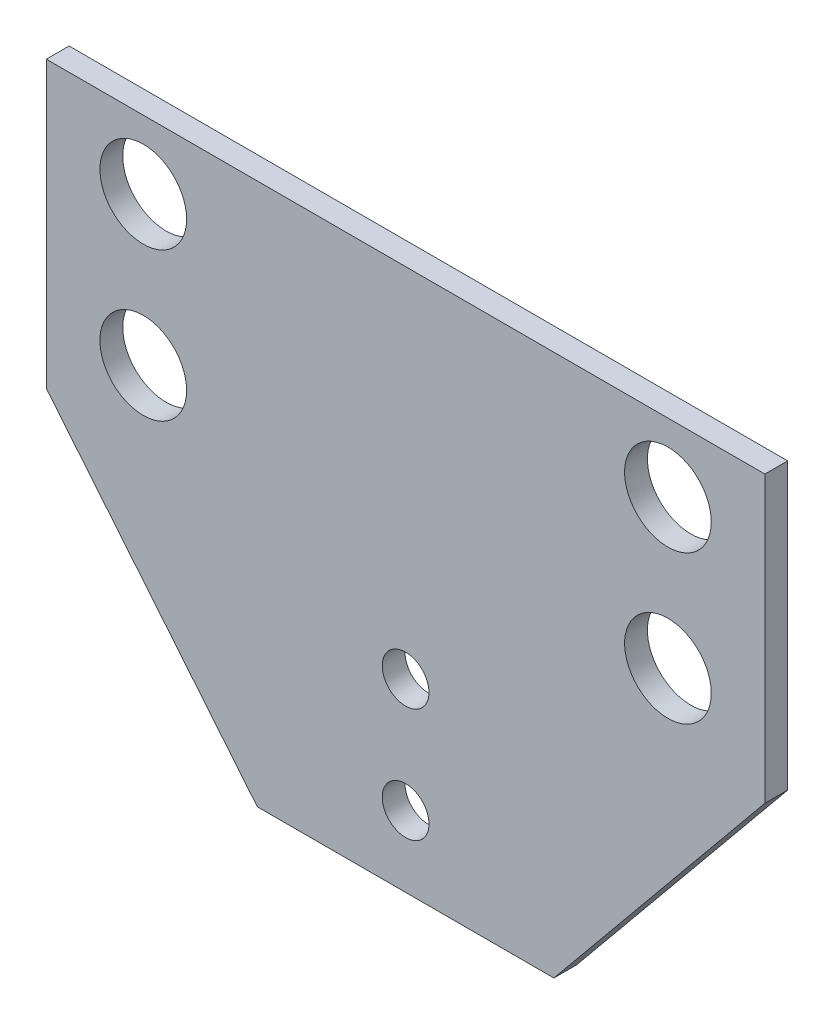
ISO-10303-21;
HEADER;
FILE_DESCRIPTION(('STEP AP214'),'2;1');
FILE_NAME('part.step','',(''),(''),'','','');
FILE_SCHEMA(('AUTOMOTIVE_DESIGN { 1 0 10303 214 1 1 1 1 }'));
ENDSEC;
DATA;
#1=APPLICATION_CONTEXT('core data for automotive mechanical design processes');
#2=APPLICATION_PROTOCOL_DEFINITION('international standard','automotive_design',2000,#1);
#3=PRODUCT_CONTEXT('',#1,'mechanical');
#4=PRODUCT('Part','Part','',(#3));
#5=PRODUCT_RELATED_PRODUCT_CATEGORY('part','',(#4));
#6=PRODUCT_DEFINITION_FORMATION('','',#4);
#7=PRODUCT_DEFINITION_CONTEXT('part definition',#1,'design');
#8=PRODUCT_DEFINITION('design','',#6,#7);
#9=PRODUCT_DEFINITION_SHAPE('','',#8);
#10=(LENGTH_UNIT() NAMED_UNIT(*) SI_UNIT(.MILLI.,.METRE.));
#11=(NAMED_UNIT(*) PLANE_ANGLE_UNIT() SI_UNIT($,.RADIAN.));
#12=(NAMED_UNIT(*) SI_UNIT($,.STERADIAN.) SOLID_ANGLE_UNIT());
#13=UNCERTAINTY_MEASURE_WITH_UNIT(LENGTH_MEASURE(1.E-05),#10,'distance_accuracy_value','');
#14=(GEOMETRIC_REPRESENTATION_CONTEXT(3) GLOBAL_UNCERTAINTY_ASSIGNED_CONTEXT((#13)) GLOBAL_UNIT_ASSIGNED_CONTEXT((#10,
#11,#12)) REPRESENTATION_CONTEXT('',''));
#15=CARTESIAN_POINT('',(0.,0.,0.));
#16=DIRECTION('',(0.,0.,1.));
#17=DIRECTION('',(1.,0.,0.));
#18=AXIS2_PLACEMENT_3D('',#15,#16,#17);
#19=CARTESIAN_POINT('',(31.5,0.,2.));
#20=DIRECTION('',(1.,0.,0.));
#21=DIRECTION('',(0.,0.,-1.));
#22=AXIS2_PLACEMENT_3D('',#19,#20,#21);
#23=PLANE('',#22);
#24=DIRECTION('',(0.,-1.,0.));
#25=VECTOR('',#24,1.);
#26=CARTESIAN_POINT('',(31.5,0.,0.));
#27=LINE('',#26,#25);
#28=CARTESIAN_POINT('',(31.5,9.99999999999999,0.));
#29=VERTEX_POINT('',#28);
#30=CARTESIAN_POINT('',(31.5,-15.,0.));
#31=VERTEX_POINT('',#30);
#32=EDGE_CURVE('E127',#29,#31,#27,.T.);
#33=ORIENTED_EDGE('',*,*,#32,.F.);
#34=DIRECTION('',(0.,0.,-1.));
#35=VECTOR('',#34,1.);
#36=CARTESIAN_POINT('',(31.5,9.99999999999999,2.));
#37=LINE('',#36,#35);
#38=CARTESIAN_POINT('',(31.5,9.99999999999999,2.));
#39=VERTEX_POINT('',#38);
#40=EDGE_CURVE('E11',#39,#29,#37,.T.);
#41=ORIENTED_EDGE('',*,*,#40,.F.);
#42=DIRECTION('',(0.,-1.,0.));
#43=VECTOR('',#42,1.);
#44=CARTESIAN_POINT('',(31.5,0.,2.));
#45=LINE('',#44,#43);
#46=CARTESIAN_POINT('',(31.5,-15.,2.));
#47=VERTEX_POINT('',#46);
#48=EDGE_CURVE('E62',#39,#47,#45,.T.);
#49=ORIENTED_EDGE('',*,*,#48,.T.);
#50=DIRECTION('',(0.,0.,-1.));
#51=VECTOR('',#50,1.);
#52=CARTESIAN_POINT('',(31.5,-15.,2.));
#53=LINE('',#52,#51);
#54=EDGE_CURVE('E81',#47,#31,#53,.T.);
#55=ORIENTED_EDGE('',*,*,#54,.T.);
#56=EDGE_LOOP('',(#33,#41,#49,#55));
#57=FACE_BOUND('',#56,.T.);
#58=ADVANCED_FACE('F45',(#57),#23,.T.);
#59=CARTESIAN_POINT('',(0.,9.99999999999999,2.));
#60=DIRECTION('',(0.,-1.,0.));
#61=DIRECTION('',(1.,0.,0.));
#62=AXIS2_PLACEMENT_3D('',#59,#60,#61);
#63=PLANE('',#62);
#64=DIRECTION('',(-1.,0.,0.));
#65=VECTOR('',#64,1.);
#66=CARTESIAN_POINT('',(0.,9.99999999999999,0.));
#67=LINE('',#66,#65);
#68=CARTESIAN_POINT('',(-31.5,10.,0.));
#69=VERTEX_POINT('',#68);
#70=EDGE_CURVE('E76',#29,#69,#67,.T.);
#71=ORIENTED_EDGE('',*,*,#70,.T.);
#72=DIRECTION('',(0.,0.,-1.));
#73=VECTOR('',#72,1.);
#74=CARTESIAN_POINT('',(-31.5,10.,2.));
#75=LINE('',#74,#73);
#76=CARTESIAN_POINT('',(-31.5,10.,2.));
#77=VERTEX_POINT('',#76);
#78=EDGE_CURVE('E54',#77,#69,#75,.T.);
#79=ORIENTED_EDGE('',*,*,#78,.F.);
#80=DIRECTION('',(-1.,0.,0.));
#81=VECTOR('',#80,1.);
#82=CARTESIAN_POINT('',(0.,9.99999999999999,2.));
#83=LINE('',#82,#81);
#84=EDGE_CURVE('E138',#39,#77,#83,.T.);
#85=ORIENTED_EDGE('',*,*,#84,.F.);
#86=ORIENTED_EDGE('',*,*,#40,.T.);
#87=EDGE_LOOP('',(#71,#79,#85,#86));
#88=FACE_BOUND('',#87,.T.);
#89=ADVANCED_FACE('F240',(#88),#63,.F.);
#90=CARTESIAN_POINT('',(-31.5,0.,2.));
#91=DIRECTION('',(1.,0.,0.));
#92=DIRECTION('',(0.,0.,-1.));
#93=AXIS2_PLACEMENT_3D('',#90,#91,#92);
#94=PLANE('',#93);
#95=DIRECTION('',(0.,-1.,0.));
#96=VECTOR('',#95,1.);
#97=CARTESIAN_POINT('',(-31.5,0.,0.));
#98=LINE('',#97,#96);
#99=CARTESIAN_POINT('',(-31.5,-15.,0.));
#100=VERTEX_POINT('',#99);
#101=EDGE_CURVE('E163',#69,#100,#98,.T.);
#102=ORIENTED_EDGE('',*,*,#101,.T.);
#103=DIRECTION('',(0.,0.,-1.));
#104=VECTOR('',#103,1.);
#105=CARTESIAN_POINT('',(-31.5,-15.,2.));
#106=LINE('',#105,#104);
#107=CARTESIAN_POINT('',(-31.5,-15.,2.));
#108=VERTEX_POINT('',#107);
#109=EDGE_CURVE('E183',#108,#100,#106,.T.);
#110=ORIENTED_EDGE('',*,*,#109,.F.);
#111=DIRECTION('',(0.,-1.,0.));
#112=VECTOR('',#111,1.);
#113=CARTESIAN_POINT('',(-31.5,0.,2.));
#114=LINE('',#113,#112);
#115=EDGE_CURVE('E142',#77,#108,#114,.T.);
#116=ORIENTED_EDGE('',*,*,#115,.F.);
#117=ORIENTED_EDGE('',*,*,#78,.T.);
#118=EDGE_LOOP('',(#102,#110,#116,#117));
#119=FACE_BOUND('',#118,.T.);
#120=ADVANCED_FACE('F190',(#119),#94,.F.);
#121=CARTESIAN_POINT('',(23.,-9.00000000000001,2.));
#122=DIRECTION('',(0.,0.,-1.));
#123=DIRECTION('',(-1.,0.,0.));
#124=AXIS2_PLACEMENT_3D('',#121,#122,#123);
#125=CYLINDRICAL_SURFACE('',#124,3.8);
#126=CARTESIAN_POINT('',(23.,-9.00000000000001,2.));
#127=DIRECTION('',(0.,0.,1.));
#128=DIRECTION('',(1.,0.,0.));
#129=AXIS2_PLACEMENT_3D('',#126,#127,#128);
#130=CIRCLE('',#129,3.8);
#131=CARTESIAN_POINT('',(26.8,-9.00000000000001,2.));
#132=VERTEX_POINT('',#131);
#133=EDGE_CURVE('E153',#132,#132,#130,.F.);
#134=ORIENTED_EDGE('',*,*,#133,.F.);
#135=EDGE_LOOP('',(#134));
#136=FACE_BOUND('',#135,.T.);
#137=CARTESIAN_POINT('',(23.,-9.00000000000001,0.));
#138=DIRECTION('',(0.,0.,1.));
#139=DIRECTION('',(1.,0.,0.));
#140=AXIS2_PLACEMENT_3D('',#137,#138,#139);
#141=CIRCLE('',#140,3.8);
#142=CARTESIAN_POINT('',(26.8,-9.00000000000001,0.));
#143=VERTEX_POINT('',#142);
#144=EDGE_CURVE('E174',#143,#143,#141,.F.);
#145=ORIENTED_EDGE('',*,*,#144,.T.);
#146=EDGE_LOOP('',(#145));
#147=FACE_BOUND('',#146,.T.);
#148=ADVANCED_FACE('F247',(#136,#147),#125,.F.);
#149=CARTESIAN_POINT('',(-23.,-9.00000000000001,2.));
#150=DIRECTION('',(0.,0.,-1.));
#151=DIRECTION('',(-1.,0.,0.));
#152=AXIS2_PLACEMENT_3D('',#149,#150,#151);
#153=CYLINDRICAL_SURFACE('',#152,3.8);
#154=CARTESIAN_POINT('',(-23.,-9.00000000000001,2.));
#155=DIRECTION('',(0.,0.,1.));
#156=DIRECTION('',(1.,0.,0.));
#157=AXIS2_PLACEMENT_3D('',#154,#155,#156);
#158=CIRCLE('',#157,3.8);
#159=CARTESIAN_POINT('',(-19.2,-9.00000000000001,2.));
#160=VERTEX_POINT('',#159);
#161=EDGE_CURVE('E149',#160,#160,#158,.T.);
#162=ORIENTED_EDGE('',*,*,#161,.T.);
#163=EDGE_LOOP('',(#162));
#164=FACE_BOUND('',#163,.T.);
#165=CARTESIAN_POINT('',(-23.,-9.00000000000001,0.));
#166=DIRECTION('',(0.,0.,1.));
#167=DIRECTION('',(1.,0.,0.));
#168=AXIS2_PLACEMENT_3D('',#165,#166,#167);
#169=CIRCLE('',#168,3.8);
#170=CARTESIAN_POINT('',(-19.2,-9.00000000000001,0.));
#171=VERTEX_POINT('',#170);
#172=EDGE_CURVE('E170',#171,#171,#169,.T.);
#173=ORIENTED_EDGE('',*,*,#172,.F.);
#174=EDGE_LOOP('',(#173));
#175=FACE_BOUND('',#174,.T.);
#176=ADVANCED_FACE('F252',(#164,#175),#153,.F.);
#177=CARTESIAN_POINT('',(-23.,4.,2.));
#178=DIRECTION('',(0.,0.,-1.));
#179=DIRECTION('',(-1.,0.,0.));
#180=AXIS2_PLACEMENT_3D('',#177,#178,#179);
#181=CYLINDRICAL_SURFACE('',#180,3.8);
#182=CARTESIAN_POINT('',(-23.,4.,2.));
#183=DIRECTION('',(0.,0.,1.));
#184=DIRECTION('',(1.,0.,0.));
#185=AXIS2_PLACEMENT_3D('',#182,#183,#184);
#186=CIRCLE('',#185,3.8);
#187=CARTESIAN_POINT('',(-19.2,4.,2.));
#188=VERTEX_POINT('',#187);
#189=EDGE_CURVE('E145',#188,#188,#186,.T.);
#190=ORIENTED_EDGE('',*,*,#189,.T.);
#191=EDGE_LOOP('',(#190));
#192=FACE_BOUND('',#191,.T.);
#193=CARTESIAN_POINT('',(-23.,4.,0.));
#194=DIRECTION('',(0.,0.,1.));
#195=DIRECTION('',(1.,0.,0.));
#196=AXIS2_PLACEMENT_3D('',#193,#194,#195);
#197=CIRCLE('',#196,3.8);
#198=CARTESIAN_POINT('',(-19.2,4.,0.));
#199=VERTEX_POINT('',#198);
#200=EDGE_CURVE('E166',#199,#199,#197,.T.);
#201=ORIENTED_EDGE('',*,*,#200,.F.);
#202=EDGE_LOOP('',(#201));
#203=FACE_BOUND('',#202,.T.);
#204=ADVANCED_FACE('F235',(#192,#203),#181,.F.);
#205=CARTESIAN_POINT('',(23.,4.,2.));
#206=DIRECTION('',(0.,0.,-1.));
#207=DIRECTION('',(-1.,0.,0.));
#208=AXIS2_PLACEMENT_3D('',#205,#206,#207);
#209=CYLINDRICAL_SURFACE('',#208,3.8);
#210=CARTESIAN_POINT('',(23.,4.,2.));
#211=DIRECTION('',(0.,0.,1.));
#212=DIRECTION('',(1.,0.,0.));
#213=AXIS2_PLACEMENT_3D('',#210,#211,#212);
#214=CIRCLE('',#213,3.8);
#215=CARTESIAN_POINT('',(26.8,4.,2.));
#216=VERTEX_POINT('',#215);
#217=EDGE_CURVE('E157',#216,#216,#214,.F.);
#218=ORIENTED_EDGE('',*,*,#217,.F.);
#219=EDGE_LOOP('',(#218));
#220=FACE_BOUND('',#219,.T.);
#221=CARTESIAN_POINT('',(23.,4.,0.));
#222=DIRECTION('',(0.,0.,1.));
#223=DIRECTION('',(1.,0.,0.));
#224=AXIS2_PLACEMENT_3D('',#221,#222,#223);
#225=CIRCLE('',#224,3.8);
#226=CARTESIAN_POINT('',(26.8,4.,0.));
#227=VERTEX_POINT('',#226);
#228=EDGE_CURVE('E139',#227,#227,#225,.F.);
#229=ORIENTED_EDGE('',*,*,#228,.T.);
#230=EDGE_LOOP('',(#229));
#231=FACE_BOUND('',#230,.T.);
#232=ADVANCED_FACE('F228',(#220,#231),#209,.F.);
#233=CARTESIAN_POINT('',(0.,0.,2.));
#234=DIRECTION('',(0.,0.,1.));
#235=DIRECTION('',(1.,0.,0.));
#236=AXIS2_PLACEMENT_3D('',#233,#234,#235);
#237=PLANE('',#236);
#238=ORIENTED_EDGE('',*,*,#48,.F.);
#239=ORIENTED_EDGE('',*,*,#84,.T.);
#240=ORIENTED_EDGE('',*,*,#115,.T.);
#241=DIRECTION('',(-0.63484159071382,0.772642320029098,0.));
#242=VECTOR('',#241,1.);
#243=CARTESIAN_POINT('',(-26.1623310655497,-21.4962802837536,2.));
#244=LINE('',#243,#242);
#245=CARTESIAN_POINT('',(-13.,-37.5156686795933,2.));
#246=VERTEX_POINT('',#245);
#247=EDGE_CURVE('E111',#246,#108,#244,.T.);
#248=ORIENTED_EDGE('',*,*,#247,.F.);
#249=DIRECTION('',(1.,0.,0.));
#250=VECTOR('',#249,1.);
#251=CARTESIAN_POINT('',(0.,-37.5156686795933,2.));
#252=LINE('',#251,#250);
#253=CARTESIAN_POINT('',(13.,-37.5156686795933,2.));
#254=VERTEX_POINT('',#253);
#255=EDGE_CURVE('E112',#246,#254,#252,.T.);
#256=ORIENTED_EDGE('',*,*,#255,.T.);
#257=DIRECTION('',(0.63484159071382,0.772642320029098,0.));
#258=VECTOR('',#257,1.);
#259=CARTESIAN_POINT('',(26.1623310655497,-21.4962802837536,2.));
#260=LINE('',#259,#258);
#261=EDGE_CURVE('E102',#254,#47,#260,.T.);
#262=ORIENTED_EDGE('',*,*,#261,.T.);
#263=EDGE_LOOP('',(#238,#239,#240,#248,#256,#262));
#264=FACE_BOUND('',#263,.T.);
#265=ORIENTED_EDGE('',*,*,#189,.F.);
#266=EDGE_LOOP('',(#265));
#267=FACE_BOUND('',#266,.T.);
#268=ORIENTED_EDGE('',*,*,#161,.F.);
#269=EDGE_LOOP('',(#268));
#270=FACE_BOUND('',#269,.T.);
#271=ORIENTED_EDGE('',*,*,#133,.T.);
#272=EDGE_LOOP('',(#271));
#273=FACE_BOUND('',#272,.T.);
#274=ORIENTED_EDGE('',*,*,#217,.T.);
#275=EDGE_LOOP('',(#274));
#276=FACE_BOUND('',#275,.T.);
#277=CARTESIAN_POINT('',(0.,-31.2999555570793,2.));
#278=DIRECTION('',(0.,0.,1.));
#279=DIRECTION('',(1.,0.,0.));
#280=AXIS2_PLACEMENT_3D('',#277,#278,#279);
#281=CIRCLE('',#280,2.05);
#282=CARTESIAN_POINT('',(2.05,-31.2999555570793,2.));
#283=VERTEX_POINT('',#282);
#284=EDGE_CURVE('E200',#283,#283,#281,.T.);
#285=ORIENTED_EDGE('',*,*,#284,.F.);
#286=EDGE_LOOP('',(#285));
#287=FACE_BOUND('',#286,.T.);
#288=CARTESIAN_POINT('',(0.,-21.3220695835742,2.));
#289=DIRECTION('',(0.,0.,1.));
#290=DIRECTION('',(1.,0.,0.));
#291=AXIS2_PLACEMENT_3D('',#288,#289,#290);
#292=CIRCLE('',#291,2.05);
#293=CARTESIAN_POINT('',(2.05,-21.3220695835742,2.));
#294=VERTEX_POINT('',#293);
#295=EDGE_CURVE('E121',#294,#294,#292,.T.);
#296=ORIENTED_EDGE('',*,*,#295,.F.);
#297=EDGE_LOOP('',(#296));
#298=FACE_BOUND('',#297,.T.);
#299=ADVANCED_FACE('F116',(#264,#267,#270,#273,#276,#287,#298),#237,.T.);
#300=CARTESIAN_POINT('',(0.,0.,0.));
#301=DIRECTION('',(0.,0.,1.));
#302=DIRECTION('',(1.,0.,0.));
#303=AXIS2_PLACEMENT_3D('',#300,#301,#302);
#304=PLANE('',#303);
#305=ORIENTED_EDGE('',*,*,#32,.T.);
#306=DIRECTION('',(0.63484159071382,0.772642320029098,0.));
#307=VECTOR('',#306,1.);
#308=CARTESIAN_POINT('',(26.1623310655497,-21.4962802837536,0.));
#309=LINE('',#308,#307);
#310=CARTESIAN_POINT('',(13.,-37.5156686795933,0.));
#311=VERTEX_POINT('',#310);
#312=EDGE_CURVE('E201',#311,#31,#309,.T.);
#313=ORIENTED_EDGE('',*,*,#312,.F.);
#314=DIRECTION('',(1.,0.,0.));
#315=VECTOR('',#314,1.);
#316=CARTESIAN_POINT('',(0.,-37.5156686795933,0.));
#317=LINE('',#316,#315);
#318=CARTESIAN_POINT('',(-13.,-37.5156686795933,0.));
#319=VERTEX_POINT('',#318);
#320=EDGE_CURVE('E125',#319,#311,#317,.T.);
#321=ORIENTED_EDGE('',*,*,#320,.F.);
#322=DIRECTION('',(-0.63484159071382,0.772642320029098,0.));
#323=VECTOR('',#322,1.);
#324=CARTESIAN_POINT('',(-26.1623310655497,-21.4962802837536,0.));
#325=LINE('',#324,#323);
#326=EDGE_CURVE('E197',#319,#100,#325,.T.);
#327=ORIENTED_EDGE('',*,*,#326,.T.);
#328=ORIENTED_EDGE('',*,*,#101,.F.);
#329=ORIENTED_EDGE('',*,*,#70,.F.);
#330=EDGE_LOOP('',(#305,#313,#321,#327,#328,#329));
#331=FACE_BOUND('',#330,.T.);
#332=ORIENTED_EDGE('',*,*,#200,.T.);
#333=EDGE_LOOP('',(#332));
#334=FACE_BOUND('',#333,.T.);
#335=ORIENTED_EDGE('',*,*,#172,.T.);
#336=EDGE_LOOP('',(#335));
#337=FACE_BOUND('',#336,.T.);
#338=ORIENTED_EDGE('',*,*,#144,.F.);
#339=EDGE_LOOP('',(#338));
#340=FACE_BOUND('',#339,.T.);
#341=ORIENTED_EDGE('',*,*,#228,.F.);
#342=EDGE_LOOP('',(#341));
#343=FACE_BOUND('',#342,.T.);
#344=CARTESIAN_POINT('',(0.,-31.2999555570793,0.));
#345=DIRECTION('',(0.,0.,1.));
#346=DIRECTION('',(1.,0.,0.));
#347=AXIS2_PLACEMENT_3D('',#344,#345,#346);
#348=CIRCLE('',#347,2.05);
#349=CARTESIAN_POINT('',(2.05,-31.2999555570793,0.));
#350=VERTEX_POINT('',#349);
#351=EDGE_CURVE('E214',#350,#350,#348,.T.);
#352=ORIENTED_EDGE('',*,*,#351,.T.);
#353=EDGE_LOOP('',(#352));
#354=FACE_BOUND('',#353,.T.);
#355=CARTESIAN_POINT('',(0.,-21.3220695835742,0.));
#356=DIRECTION('',(0.,0.,1.));
#357=DIRECTION('',(1.,0.,0.));
#358=AXIS2_PLACEMENT_3D('',#355,#356,#357);
#359=CIRCLE('',#358,2.05);
#360=CARTESIAN_POINT('',(2.05,-21.3220695835742,0.));
#361=VERTEX_POINT('',#360);
#362=EDGE_CURVE('E210',#361,#361,#359,.T.);
#363=ORIENTED_EDGE('',*,*,#362,.T.);
#364=EDGE_LOOP('',(#363));
#365=FACE_BOUND('',#364,.T.);
#366=ADVANCED_FACE('F194',(#331,#334,#337,#340,#343,#354,#365),#304,.F.);
#367=CARTESIAN_POINT('',(0.,-37.5156686795933,2.));
#368=DIRECTION('',(0.,1.,0.));
#369=DIRECTION('',(0.,0.,1.));
#370=AXIS2_PLACEMENT_3D('',#367,#368,#369);
#371=PLANE('',#370);
#372=ORIENTED_EDGE('',*,*,#320,.T.);
#373=DIRECTION('',(0.,0.,-1.));
#374=VECTOR('',#373,1.);
#375=CARTESIAN_POINT('',(13.,-37.5156686795933,2.));
#376=LINE('',#375,#374);
#377=EDGE_CURVE('E107',#254,#311,#376,.T.);
#378=ORIENTED_EDGE('',*,*,#377,.F.);
#379=ORIENTED_EDGE('',*,*,#255,.F.);
#380=DIRECTION('',(0.,0.,-1.));
#381=VECTOR('',#380,1.);
#382=CARTESIAN_POINT('',(-13.,-37.5156686795933,2.));
#383=LINE('',#382,#381);
#384=EDGE_CURVE('E128',#246,#319,#383,.T.);
#385=ORIENTED_EDGE('',*,*,#384,.T.);
#386=EDGE_LOOP('',(#372,#378,#379,#385));
#387=FACE_BOUND('',#386,.T.);
#388=ADVANCED_FACE('F123',(#387),#371,.F.);
#389=CARTESIAN_POINT('',(26.1623310655497,-21.4962802837536,2.));
#390=DIRECTION('',(-0.772642320029098,0.63484159071382,0.));
#391=DIRECTION('',(-0.63484159071382,-0.772642320029098,0.));
#392=AXIS2_PLACEMENT_3D('',#389,#390,#391);
#393=PLANE('',#392);
#394=ORIENTED_EDGE('',*,*,#312,.T.);
#395=ORIENTED_EDGE('',*,*,#54,.F.);
#396=ORIENTED_EDGE('',*,*,#261,.F.);
#397=ORIENTED_EDGE('',*,*,#377,.T.);
#398=EDGE_LOOP('',(#394,#395,#396,#397));
#399=FACE_BOUND('',#398,.T.);
#400=ADVANCED_FACE('F105',(#399),#393,.F.);
#401=CARTESIAN_POINT('',(0.,-21.3220695835742,2.));
#402=DIRECTION('',(0.,0.,-1.));
#403=DIRECTION('',(-1.,0.,0.));
#404=AXIS2_PLACEMENT_3D('',#401,#402,#403);
#405=CYLINDRICAL_SURFACE('',#404,2.05);
#406=ORIENTED_EDGE('',*,*,#295,.T.);
#407=EDGE_LOOP('',(#406));
#408=FACE_BOUND('',#407,.T.);
#409=ORIENTED_EDGE('',*,*,#362,.F.);
#410=EDGE_LOOP('',(#409));
#411=FACE_BOUND('',#410,.T.);
#412=ADVANCED_FACE('F224',(#408,#411),#405,.F.);
#413=CARTESIAN_POINT('',(0.,-31.2999555570793,2.));
#414=DIRECTION('',(0.,0.,-1.));
#415=DIRECTION('',(-1.,0.,0.));
#416=AXIS2_PLACEMENT_3D('',#413,#414,#415);
#417=CYLINDRICAL_SURFACE('',#416,2.05);
#418=ORIENTED_EDGE('',*,*,#284,.T.);
#419=EDGE_LOOP('',(#418));
#420=FACE_BOUND('',#419,.T.);
#421=ORIENTED_EDGE('',*,*,#351,.F.);
#422=EDGE_LOOP('',(#421));
#423=FACE_BOUND('',#422,.T.);
#424=ADVANCED_FACE('F272',(#420,#423),#417,.F.);
#425=CARTESIAN_POINT('',(-26.1623310655497,-21.4962802837536,2.));
#426=DIRECTION('',(-0.772642320029098,-0.63484159071382,0.));
#427=DIRECTION('',(0.63484159071382,-0.772642320029098,0.));
#428=AXIS2_PLACEMENT_3D('',#425,#426,#427);
#429=PLANE('',#428);
#430=ORIENTED_EDGE('',*,*,#326,.F.);
#431=ORIENTED_EDGE('',*,*,#384,.F.);
#432=ORIENTED_EDGE('',*,*,#247,.T.);
#433=ORIENTED_EDGE('',*,*,#109,.T.);
#434=EDGE_LOOP('',(#430,#431,#432,#433));
#435=FACE_BOUND('',#434,.T.);
#436=ADVANCED_FACE('F278',(#435),#429,.T.);
#437=CLOSED_SHELL('',(#58,#89,#120,#148,#176,#204,#232,#299,#366,#388,#400,#412,#424,#436));
#438=MANIFOLD_SOLID_BREP('B2',#437);
#439=ADVANCED_BREP_SHAPE_REPRESENTATION('',(#18,#438),#14);
#440=SHAPE_DEFINITION_REPRESENTATION(#9,#439);
ENDSEC;
END-ISO-10303-21;
